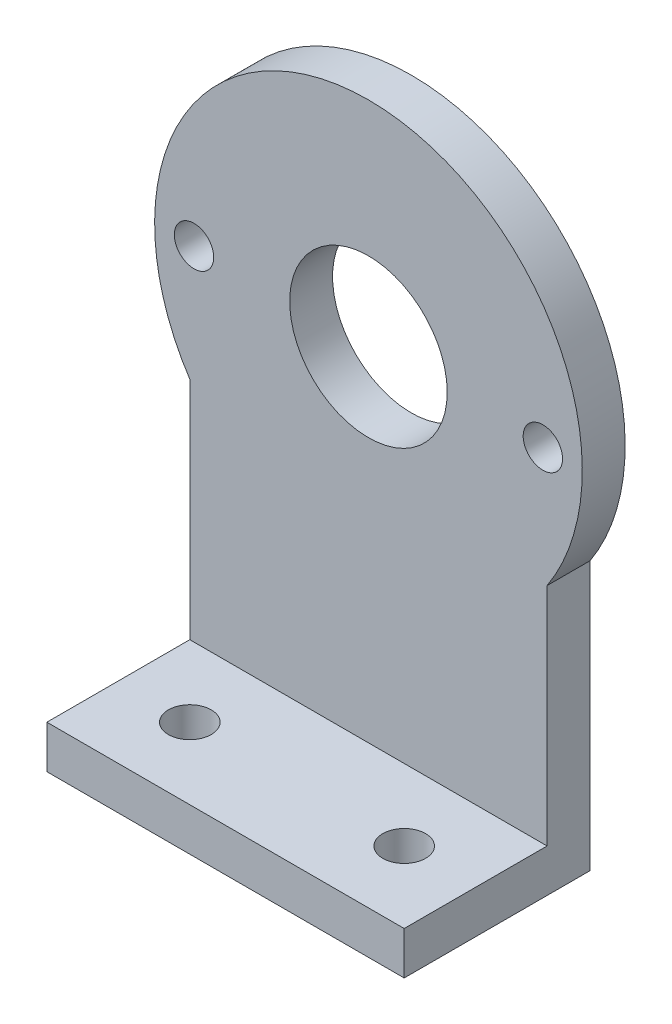
ISO-10303-21;
HEADER;
FILE_DESCRIPTION(('STEP AP214'),'2;1');
FILE_NAME('part.step','',(''),(''),'','','');
FILE_SCHEMA(('AUTOMOTIVE_DESIGN { 1 0 10303 214 1 1 1 1 }'));
ENDSEC;
DATA;
#1=APPLICATION_CONTEXT('core data for automotive mechanical design processes');
#2=APPLICATION_PROTOCOL_DEFINITION('international standard','automotive_design',2000,#1);
#3=PRODUCT_CONTEXT('',#1,'mechanical');
#4=PRODUCT('Part','Part','',(#3));
#5=PRODUCT_RELATED_PRODUCT_CATEGORY('part','',(#4));
#6=PRODUCT_DEFINITION_FORMATION('','',#4);
#7=PRODUCT_DEFINITION_CONTEXT('part definition',#1,'design');
#8=PRODUCT_DEFINITION('design','',#6,#7);
#9=PRODUCT_DEFINITION_SHAPE('','',#8);
#10=(LENGTH_UNIT() NAMED_UNIT(*) SI_UNIT(.MILLI.,.METRE.));
#11=(NAMED_UNIT(*) PLANE_ANGLE_UNIT() SI_UNIT($,.RADIAN.));
#12=(NAMED_UNIT(*) SI_UNIT($,.STERADIAN.) SOLID_ANGLE_UNIT());
#13=UNCERTAINTY_MEASURE_WITH_UNIT(LENGTH_MEASURE(1.E-05),#10,'distance_accuracy_value','');
#14=(GEOMETRIC_REPRESENTATION_CONTEXT(3) GLOBAL_UNCERTAINTY_ASSIGNED_CONTEXT((#13)) GLOBAL_UNIT_ASSIGNED_CONTEXT((#10,
#11,#12)) REPRESENTATION_CONTEXT('',''));
#15=CARTESIAN_POINT('',(0.,0.,0.));
#16=DIRECTION('',(0.,0.,1.));
#17=DIRECTION('',(1.,0.,0.));
#18=AXIS2_PLACEMENT_3D('',#15,#16,#17);
#19=CARTESIAN_POINT('',(0.,0.,3.81));
#20=DIRECTION('',(0.,0.,-1.));
#21=DIRECTION('',(-1.,0.,0.));
#22=AXIS2_PLACEMENT_3D('',#19,#20,#21);
#23=CYLINDRICAL_SURFACE('',#22,19.);
#24=CARTESIAN_POINT('',(0.,0.,3.81));
#25=DIRECTION('',(0.,0.,1.));
#26=DIRECTION('',(1.,0.,0.));
#27=AXIS2_PLACEMENT_3D('',#24,#25,#26);
#28=CIRCLE('',#27,19.);
#29=CARTESIAN_POINT('',(15.875,-10.4395581803063,3.81));
#30=VERTEX_POINT('',#29);
#31=CARTESIAN_POINT('',(-15.875,-10.4395581803063,3.81));
#32=VERTEX_POINT('',#31);
#33=EDGE_CURVE('E155',#30,#32,#28,.T.);
#34=ORIENTED_EDGE('',*,*,#33,.F.);
#35=DIRECTION('',(0.,0.,-1.));
#36=VECTOR('',#35,1.);
#37=CARTESIAN_POINT('',(15.875,-10.4395581803063,3.81));
#38=LINE('',#37,#36);
#39=CARTESIAN_POINT('',(15.875,-10.4395581803063,0.));
#40=VERTEX_POINT('',#39);
#41=EDGE_CURVE('E12',#30,#40,#38,.T.);
#42=ORIENTED_EDGE('',*,*,#41,.T.);
#43=CARTESIAN_POINT('',(0.,0.,0.));
#44=DIRECTION('',(0.,0.,1.));
#45=DIRECTION('',(1.,0.,0.));
#46=AXIS2_PLACEMENT_3D('',#43,#44,#45);
#47=CIRCLE('',#46,19.);
#48=CARTESIAN_POINT('',(-15.875,-10.4395581803063,0.));
#49=VERTEX_POINT('',#48);
#50=EDGE_CURVE('E158',#40,#49,#47,.T.);
#51=ORIENTED_EDGE('',*,*,#50,.T.);
#52=DIRECTION('',(0.,0.,-1.));
#53=VECTOR('',#52,1.);
#54=CARTESIAN_POINT('',(-15.875,-10.4395581803063,3.81));
#55=LINE('',#54,#53);
#56=EDGE_CURVE('E67',#32,#49,#55,.T.);
#57=ORIENTED_EDGE('',*,*,#56,.F.);
#58=EDGE_LOOP('',(#34,#42,#51,#57));
#59=FACE_BOUND('',#58,.T.);
#60=ADVANCED_FACE('F58',(#59),#23,.T.);
#61=CARTESIAN_POINT('',(0.,0.,0.));
#62=DIRECTION('',(0.,0.,1.));
#63=DIRECTION('',(1.,0.,0.));
#64=AXIS2_PLACEMENT_3D('',#61,#62,#63);
#65=PLANE('',#64);
#66=CARTESIAN_POINT('',(15.5,0.,0.));
#67=DIRECTION('',(0.,0.,1.));
#68=DIRECTION('',(1.,0.,0.));
#69=AXIS2_PLACEMENT_3D('',#66,#67,#68);
#70=CIRCLE('',#69,1.75);
#71=CARTESIAN_POINT('',(17.25,0.,0.));
#72=VERTEX_POINT('',#71);
#73=EDGE_CURVE('E235',#72,#72,#70,.T.);
#74=ORIENTED_EDGE('',*,*,#73,.T.);
#75=EDGE_LOOP('',(#74));
#76=FACE_BOUND('',#75,.T.);
#77=CARTESIAN_POINT('',(-15.5,0.,0.));
#78=DIRECTION('',(0.,0.,1.));
#79=DIRECTION('',(-1.,0.,0.));
#80=AXIS2_PLACEMENT_3D('',#77,#78,#79);
#81=CIRCLE('',#80,1.75);
#82=CARTESIAN_POINT('',(-13.75,0.,0.));
#83=VERTEX_POINT('',#82);
#84=EDGE_CURVE('E242',#83,#83,#81,.T.);
#85=ORIENTED_EDGE('',*,*,#84,.T.);
#86=EDGE_LOOP('',(#85));
#87=FACE_BOUND('',#86,.T.);
#88=CARTESIAN_POINT('',(0.,0.,0.));
#89=DIRECTION('',(0.,0.,1.));
#90=DIRECTION('',(1.,0.,0.));
#91=AXIS2_PLACEMENT_3D('',#88,#89,#90);
#92=CIRCLE('',#91,7.);
#93=CARTESIAN_POINT('',(7.,0.,0.));
#94=VERTEX_POINT('',#93);
#95=EDGE_CURVE('E149',#94,#94,#92,.T.);
#96=ORIENTED_EDGE('',*,*,#95,.T.);
#97=EDGE_LOOP('',(#96));
#98=FACE_BOUND('',#97,.T.);
#99=ORIENTED_EDGE('',*,*,#50,.F.);
#100=DIRECTION('',(0.,-1.,0.));
#101=VECTOR('',#100,1.);
#102=CARTESIAN_POINT('',(15.875,-10.4395581803063,0.));
#103=LINE('',#102,#101);
#104=CARTESIAN_POINT('',(15.875,-34.29,0.));
#105=VERTEX_POINT('',#104);
#106=EDGE_CURVE('E166',#40,#105,#103,.T.);
#107=ORIENTED_EDGE('',*,*,#106,.T.);
#108=DIRECTION('',(1.,0.,0.));
#109=VECTOR('',#108,1.);
#110=CARTESIAN_POINT('',(-15.875,-34.29,0.));
#111=LINE('',#110,#109);
#112=CARTESIAN_POINT('',(-15.875,-34.29,0.));
#113=VERTEX_POINT('',#112);
#114=EDGE_CURVE('E152',#113,#105,#111,.T.);
#115=ORIENTED_EDGE('',*,*,#114,.F.);
#116=DIRECTION('',(0.,-1.,0.));
#117=VECTOR('',#116,1.);
#118=CARTESIAN_POINT('',(-15.875,-10.4395581803063,0.));
#119=LINE('',#118,#117);
#120=EDGE_CURVE('E97',#49,#113,#119,.T.);
#121=ORIENTED_EDGE('',*,*,#120,.F.);
#122=EDGE_LOOP('',(#99,#107,#115,#121));
#123=FACE_BOUND('',#122,.T.);
#124=ADVANCED_FACE('F171',(#76,#87,#98,#123),#65,.F.);
#125=CARTESIAN_POINT('',(0.,0.,3.81));
#126=DIRECTION('',(0.,0.,1.));
#127=DIRECTION('',(1.,0.,0.));
#128=AXIS2_PLACEMENT_3D('',#125,#126,#127);
#129=PLANE('',#128);
#130=CARTESIAN_POINT('',(15.5,0.,3.81));
#131=DIRECTION('',(0.,0.,1.));
#132=DIRECTION('',(1.,0.,0.));
#133=AXIS2_PLACEMENT_3D('',#130,#131,#132);
#134=CIRCLE('',#133,1.75);
#135=CARTESIAN_POINT('',(17.25,0.,3.81));
#136=VERTEX_POINT('',#135);
#137=EDGE_CURVE('E237',#136,#136,#134,.T.);
#138=ORIENTED_EDGE('',*,*,#137,.F.);
#139=EDGE_LOOP('',(#138));
#140=FACE_BOUND('',#139,.T.);
#141=CARTESIAN_POINT('',(-15.5,0.,3.81));
#142=DIRECTION('',(0.,0.,1.));
#143=DIRECTION('',(-1.,0.,0.));
#144=AXIS2_PLACEMENT_3D('',#141,#142,#143);
#145=CIRCLE('',#144,1.75);
#146=CARTESIAN_POINT('',(-13.75,0.,3.81));
#147=VERTEX_POINT('',#146);
#148=EDGE_CURVE('E238',#147,#147,#145,.T.);
#149=ORIENTED_EDGE('',*,*,#148,.F.);
#150=EDGE_LOOP('',(#149));
#151=FACE_BOUND('',#150,.T.);
#152=DIRECTION('',(-1.,0.,0.));
#153=VECTOR('',#152,1.);
#154=CARTESIAN_POINT('',(-15.875,-30.48,3.81));
#155=LINE('',#154,#153);
#156=CARTESIAN_POINT('',(15.875,-30.48,3.81));
#157=VERTEX_POINT('',#156);
#158=CARTESIAN_POINT('',(-15.875,-30.48,3.81));
#159=VERTEX_POINT('',#158);
#160=EDGE_CURVE('E75',#157,#159,#155,.T.);
#161=ORIENTED_EDGE('',*,*,#160,.F.);
#162=DIRECTION('',(0.,-1.,0.));
#163=VECTOR('',#162,1.);
#164=CARTESIAN_POINT('',(15.875,-10.4395581803063,3.81));
#165=LINE('',#164,#163);
#166=EDGE_CURVE('E162',#30,#157,#165,.T.);
#167=ORIENTED_EDGE('',*,*,#166,.F.);
#168=ORIENTED_EDGE('',*,*,#33,.T.);
#169=DIRECTION('',(0.,-1.,0.));
#170=VECTOR('',#169,1.);
#171=CARTESIAN_POINT('',(-15.875,-10.4395581803063,3.81));
#172=LINE('',#171,#170);
#173=EDGE_CURVE('E123',#32,#159,#172,.T.);
#174=ORIENTED_EDGE('',*,*,#173,.T.);
#175=EDGE_LOOP('',(#161,#167,#168,#174));
#176=FACE_BOUND('',#175,.T.);
#177=CARTESIAN_POINT('',(0.,0.,3.81));
#178=DIRECTION('',(0.,0.,1.));
#179=DIRECTION('',(1.,0.,0.));
#180=AXIS2_PLACEMENT_3D('',#177,#178,#179);
#181=CIRCLE('',#180,7.);
#182=CARTESIAN_POINT('',(7.,0.,3.81));
#183=VERTEX_POINT('',#182);
#184=EDGE_CURVE('E148',#183,#183,#181,.T.);
#185=ORIENTED_EDGE('',*,*,#184,.F.);
#186=EDGE_LOOP('',(#185));
#187=FACE_BOUND('',#186,.T.);
#188=ADVANCED_FACE('F177',(#140,#151,#176,#187),#129,.T.);
#189=CARTESIAN_POINT('',(-15.875,-10.4395581803063,3.81));
#190=DIRECTION('',(1.,0.,0.));
#191=DIRECTION('',(0.,1.,0.));
#192=AXIS2_PLACEMENT_3D('',#189,#190,#191);
#193=PLANE('',#192);
#194=ORIENTED_EDGE('',*,*,#120,.T.);
#195=DIRECTION('',(0.,0.,-1.));
#196=VECTOR('',#195,1.);
#197=CARTESIAN_POINT('',(-15.875,-34.29,3.81));
#198=LINE('',#197,#196);
#199=CARTESIAN_POINT('',(-15.875,-34.29,16.51));
#200=VERTEX_POINT('',#199);
#201=EDGE_CURVE('E114',#200,#113,#198,.T.);
#202=ORIENTED_EDGE('',*,*,#201,.F.);
#203=DIRECTION('',(0.,-1.,0.));
#204=VECTOR('',#203,1.);
#205=CARTESIAN_POINT('',(-15.875,-34.29,16.51));
#206=LINE('',#205,#204);
#207=CARTESIAN_POINT('',(-15.875,-30.48,16.51));
#208=VERTEX_POINT('',#207);
#209=EDGE_CURVE('E119',#208,#200,#206,.T.);
#210=ORIENTED_EDGE('',*,*,#209,.F.);
#211=DIRECTION('',(0.,0.,-1.));
#212=VECTOR('',#211,1.);
#213=CARTESIAN_POINT('',(-15.875,-30.48,16.51));
#214=LINE('',#213,#212);
#215=EDGE_CURVE('E142',#208,#159,#214,.T.);
#216=ORIENTED_EDGE('',*,*,#215,.T.);
#217=ORIENTED_EDGE('',*,*,#173,.F.);
#218=ORIENTED_EDGE('',*,*,#56,.T.);
#219=EDGE_LOOP('',(#194,#202,#210,#216,#217,#218));
#220=FACE_BOUND('',#219,.T.);
#221=ADVANCED_FACE('F116',(#220),#193,.F.);
#222=CARTESIAN_POINT('',(-15.875,-34.29,3.81));
#223=DIRECTION('',(0.,1.,0.));
#224=DIRECTION('',(0.,0.,1.));
#225=AXIS2_PLACEMENT_3D('',#222,#223,#224);
#226=PLANE('',#225);
#227=CARTESIAN_POINT('',(-9.525,-34.29,10.16));
#228=DIRECTION('',(0.,1.,0.));
#229=DIRECTION('',(0.,0.,1.));
#230=AXIS2_PLACEMENT_3D('',#227,#228,#229);
#231=CIRCLE('',#230,1.905);
#232=CARTESIAN_POINT('',(-9.525,-34.29,12.065));
#233=VERTEX_POINT('',#232);
#234=EDGE_CURVE('E135',#233,#233,#231,.T.);
#235=ORIENTED_EDGE('',*,*,#234,.T.);
#236=EDGE_LOOP('',(#235));
#237=FACE_BOUND('',#236,.T.);
#238=CARTESIAN_POINT('',(9.525,-34.29,10.16));
#239=DIRECTION('',(0.,1.,0.));
#240=DIRECTION('',(0.,0.,-1.));
#241=AXIS2_PLACEMENT_3D('',#238,#239,#240);
#242=CIRCLE('',#241,1.905);
#243=CARTESIAN_POINT('',(9.525,-34.29,8.255));
#244=VERTEX_POINT('',#243);
#245=EDGE_CURVE('E138',#244,#244,#242,.T.);
#246=ORIENTED_EDGE('',*,*,#245,.T.);
#247=EDGE_LOOP('',(#246));
#248=FACE_BOUND('',#247,.T.);
#249=ORIENTED_EDGE('',*,*,#114,.T.);
#250=DIRECTION('',(0.,0.,-1.));
#251=VECTOR('',#250,1.);
#252=CARTESIAN_POINT('',(15.875,-34.29,3.81));
#253=LINE('',#252,#251);
#254=CARTESIAN_POINT('',(15.875,-34.29,16.51));
#255=VERTEX_POINT('',#254);
#256=EDGE_CURVE('E62',#255,#105,#253,.T.);
#257=ORIENTED_EDGE('',*,*,#256,.F.);
#258=DIRECTION('',(1.,0.,0.));
#259=VECTOR('',#258,1.);
#260=CARTESIAN_POINT('',(-15.875,-34.29,16.51));
#261=LINE('',#260,#259);
#262=EDGE_CURVE('E125',#200,#255,#261,.T.);
#263=ORIENTED_EDGE('',*,*,#262,.F.);
#264=ORIENTED_EDGE('',*,*,#201,.T.);
#265=EDGE_LOOP('',(#249,#257,#263,#264));
#266=FACE_BOUND('',#265,.T.);
#267=ADVANCED_FACE('F60',(#237,#248,#266),#226,.F.);
#268=CARTESIAN_POINT('',(15.875,-10.4395581803063,3.81));
#269=DIRECTION('',(1.,0.,0.));
#270=DIRECTION('',(0.,1.,0.));
#271=AXIS2_PLACEMENT_3D('',#268,#269,#270);
#272=PLANE('',#271);
#273=ORIENTED_EDGE('',*,*,#106,.F.);
#274=ORIENTED_EDGE('',*,*,#41,.F.);
#275=ORIENTED_EDGE('',*,*,#166,.T.);
#276=DIRECTION('',(0.,0.,-1.));
#277=VECTOR('',#276,1.);
#278=CARTESIAN_POINT('',(15.875,-30.48,16.51));
#279=LINE('',#278,#277);
#280=CARTESIAN_POINT('',(15.875,-30.48,16.51));
#281=VERTEX_POINT('',#280);
#282=EDGE_CURVE('E145',#281,#157,#279,.T.);
#283=ORIENTED_EDGE('',*,*,#282,.F.);
#284=DIRECTION('',(0.,1.,0.));
#285=VECTOR('',#284,1.);
#286=CARTESIAN_POINT('',(15.875,-34.29,16.51));
#287=LINE('',#286,#285);
#288=EDGE_CURVE('E128',#255,#281,#287,.T.);
#289=ORIENTED_EDGE('',*,*,#288,.F.);
#290=ORIENTED_EDGE('',*,*,#256,.T.);
#291=EDGE_LOOP('',(#273,#274,#275,#283,#289,#290));
#292=FACE_BOUND('',#291,.T.);
#293=ADVANCED_FACE('F172',(#292),#272,.T.);
#294=CARTESIAN_POINT('',(0.,0.,0.));
#295=DIRECTION('',(0.,0.,1.));
#296=DIRECTION('',(1.,0.,0.));
#297=AXIS2_PLACEMENT_3D('',#294,#295,#296);
#298=CYLINDRICAL_SURFACE('',#297,7.);
#299=CARTESIAN_POINT('',(7.,0.,0.));
#300=CARTESIAN_POINT('',(7.,0.,0.0396874999999999));
#301=CARTESIAN_POINT('',(7.,0.,0.079375));
#302=CARTESIAN_POINT('',(7.,0.,0.15875));
#303=CARTESIAN_POINT('',(7.,0.,0.1984375));
#304=CARTESIAN_POINT('',(7.,0.,0.2778125));
#305=CARTESIAN_POINT('',(7.,0.,0.3175));
#306=CARTESIAN_POINT('',(7.,0.,0.396875));
#307=CARTESIAN_POINT('',(7.,0.,0.4365625));
#308=CARTESIAN_POINT('',(7.,0.,0.5159375));
#309=CARTESIAN_POINT('',(7.,0.,0.555625));
#310=CARTESIAN_POINT('',(7.,0.,0.635));
#311=CARTESIAN_POINT('',(7.,0.,0.6746875));
#312=CARTESIAN_POINT('',(7.,0.,0.7540625));
#313=CARTESIAN_POINT('',(7.,0.,0.79375));
#314=CARTESIAN_POINT('',(7.,0.,0.873125));
#315=CARTESIAN_POINT('',(7.,0.,0.9128125));
#316=CARTESIAN_POINT('',(7.,0.,0.9921875));
#317=CARTESIAN_POINT('',(7.,0.,1.031875));
#318=CARTESIAN_POINT('',(7.,0.,1.11125));
#319=CARTESIAN_POINT('',(7.,0.,1.1509375));
#320=CARTESIAN_POINT('',(7.,0.,1.2303125));
#321=CARTESIAN_POINT('',(7.,0.,1.27));
#322=CARTESIAN_POINT('',(7.,0.,1.349375));
#323=CARTESIAN_POINT('',(7.,0.,1.3890625));
#324=CARTESIAN_POINT('',(7.,0.,1.4684375));
#325=CARTESIAN_POINT('',(7.,0.,1.508125));
#326=CARTESIAN_POINT('',(7.,0.,1.5875));
#327=CARTESIAN_POINT('',(7.,0.,1.6271875));
#328=CARTESIAN_POINT('',(7.,0.,1.7065625));
#329=CARTESIAN_POINT('',(7.,0.,1.74625));
#330=CARTESIAN_POINT('',(7.,0.,1.825625));
#331=CARTESIAN_POINT('',(7.,0.,1.8653125));
#332=CARTESIAN_POINT('',(7.,0.,1.9446875));
#333=CARTESIAN_POINT('',(7.,0.,1.984375));
#334=CARTESIAN_POINT('',(7.,0.,2.06375));
#335=CARTESIAN_POINT('',(7.,0.,2.1034375));
#336=CARTESIAN_POINT('',(7.,0.,2.1828125));
#337=CARTESIAN_POINT('',(7.,0.,2.2225));
#338=CARTESIAN_POINT('',(7.,0.,2.301875));
#339=CARTESIAN_POINT('',(7.,0.,2.3415625));
#340=CARTESIAN_POINT('',(7.,0.,2.4209375));
#341=CARTESIAN_POINT('',(7.,0.,2.460625));
#342=CARTESIAN_POINT('',(7.,0.,2.54));
#343=CARTESIAN_POINT('',(7.,0.,2.5796875));
#344=CARTESIAN_POINT('',(7.,0.,2.6590625));
#345=CARTESIAN_POINT('',(7.,0.,2.69875));
#346=CARTESIAN_POINT('',(7.,0.,2.778125));
#347=CARTESIAN_POINT('',(7.,0.,2.8178125));
#348=CARTESIAN_POINT('',(7.,0.,2.8971875));
#349=CARTESIAN_POINT('',(7.,0.,2.936875));
#350=CARTESIAN_POINT('',(7.,0.,3.01625));
#351=CARTESIAN_POINT('',(7.,0.,3.0559375));
#352=CARTESIAN_POINT('',(7.,0.,3.1353125));
#353=CARTESIAN_POINT('',(7.,0.,3.175));
#354=CARTESIAN_POINT('',(7.,0.,3.254375));
#355=CARTESIAN_POINT('',(7.,0.,3.2940625));
#356=CARTESIAN_POINT('',(7.,0.,3.3734375));
#357=CARTESIAN_POINT('',(7.,0.,3.413125));
#358=CARTESIAN_POINT('',(7.,0.,3.4925));
#359=CARTESIAN_POINT('',(7.,0.,3.5321875));
#360=CARTESIAN_POINT('',(7.,0.,3.6115625));
#361=CARTESIAN_POINT('',(7.,0.,3.65125));
#362=CARTESIAN_POINT('',(7.,0.,3.730625));
#363=CARTESIAN_POINT('',(7.,0.,3.7703125));
#364=CARTESIAN_POINT('',(7.,0.,3.81));
#365=B_SPLINE_CURVE_WITH_KNOTS('',3,(#299,#300,#301,#302,#303,#304,#305,#306,#307,#308,#309,
#310,#311,#312,#313,#314,#315,#316,#317,#318,#319,#320,#321,#322,#323,#324,#325,#326,#327,#328,
#329,#330,#331,#332,#333,#334,#335,#336,#337,#338,#339,#340,#341,#342,#343,#344,#345,#346,#347,
#348,#349,#350,#351,#352,#353,#354,#355,#356,#357,#358,#359,#360,#361,#362,#363,#364),
.UNSPECIFIED.,.F.,.F.,(4,2,2,2,2,2,2,2,2,2,2,2,2,2,2,2,2,2,2,2,2,2,2,2,2,2,2,2,2,2,2,2,4),(0.,
0.1190625,0.238125,0.3571875,0.47625,0.5953125,0.714375,0.8334375,0.9525,1.0715625,1.190625,
1.3096875,1.42875,1.5478125,1.666875,1.7859375,1.905,2.0240625,2.143125,2.2621875,2.38125,
2.5003125,2.619375,2.7384375,2.8575,2.9765625,3.095625,3.2146875,3.33375,3.4528125,3.571875,
3.6909375,3.81),.UNSPECIFIED.);
#366=EDGE_CURVE('BSEAM191',#94,#183,#365,.T.);
#367=ORIENTED_EDGE('',*,*,#95,.F.);
#368=ORIENTED_EDGE('',*,*,#184,.T.);
#369=ORIENTED_EDGE('',*,*,#366,.T.);
#370=ORIENTED_EDGE('',*,*,#366,.F.);
#371=EDGE_LOOP('',(#367,#369,#368,#370));
#372=FACE_BOUND('',#371,.T.);
#373=ADVANCED_FACE('F191',(#372),#298,.F.);
#374=CARTESIAN_POINT('',(-15.875,-30.48,16.51));
#375=DIRECTION('',(0.,-1.,0.));
#376=DIRECTION('',(0.,0.,-1.));
#377=AXIS2_PLACEMENT_3D('',#374,#375,#376);
#378=PLANE('',#377);
#379=CARTESIAN_POINT('',(-9.525,-30.48,10.16));
#380=DIRECTION('',(0.,1.,0.));
#381=DIRECTION('',(0.,0.,1.));
#382=AXIS2_PLACEMENT_3D('',#379,#380,#381);
#383=CIRCLE('',#382,1.905);
#384=CARTESIAN_POINT('',(-9.525,-30.48,12.065));
#385=VERTEX_POINT('',#384);
#386=EDGE_CURVE('E248',#385,#385,#383,.T.);
#387=ORIENTED_EDGE('',*,*,#386,.F.);
#388=EDGE_LOOP('',(#387));
#389=FACE_BOUND('',#388,.T.);
#390=CARTESIAN_POINT('',(9.525,-30.48,10.16));
#391=DIRECTION('',(0.,1.,0.));
#392=DIRECTION('',(0.,0.,-1.));
#393=AXIS2_PLACEMENT_3D('',#390,#391,#392);
#394=CIRCLE('',#393,1.905);
#395=CARTESIAN_POINT('',(9.525,-30.48,8.255));
#396=VERTEX_POINT('',#395);
#397=EDGE_CURVE('E250',#396,#396,#394,.T.);
#398=ORIENTED_EDGE('',*,*,#397,.F.);
#399=EDGE_LOOP('',(#398));
#400=FACE_BOUND('',#399,.T.);
#401=ORIENTED_EDGE('',*,*,#160,.T.);
#402=ORIENTED_EDGE('',*,*,#215,.F.);
#403=DIRECTION('',(-1.,0.,0.));
#404=VECTOR('',#403,1.);
#405=CARTESIAN_POINT('',(-15.875,-30.48,16.51));
#406=LINE('',#405,#404);
#407=EDGE_CURVE('E132',#281,#208,#406,.T.);
#408=ORIENTED_EDGE('',*,*,#407,.F.);
#409=ORIENTED_EDGE('',*,*,#282,.T.);
#410=EDGE_LOOP('',(#401,#402,#408,#409));
#411=FACE_BOUND('',#410,.T.);
#412=ADVANCED_FACE('F175',(#389,#400,#411),#378,.F.);
#413=CARTESIAN_POINT('',(0.,0.,16.51));
#414=DIRECTION('',(0.,0.,-1.));
#415=DIRECTION('',(-1.,0.,0.));
#416=AXIS2_PLACEMENT_3D('',#413,#414,#415);
#417=PLANE('',#416);
#418=ORIENTED_EDGE('',*,*,#209,.T.);
#419=ORIENTED_EDGE('',*,*,#262,.T.);
#420=ORIENTED_EDGE('',*,*,#288,.T.);
#421=ORIENTED_EDGE('',*,*,#407,.T.);
#422=EDGE_LOOP('',(#418,#419,#420,#421));
#423=FACE_BOUND('',#422,.T.);
#424=ADVANCED_FACE('F130',(#423),#417,.F.);
#425=CARTESIAN_POINT('',(9.525,-34.29,10.16));
#426=DIRECTION('',(0.,1.,0.));
#427=DIRECTION('',(0.,0.,1.));
#428=AXIS2_PLACEMENT_3D('',#425,#426,#427);
#429=CYLINDRICAL_SURFACE('',#428,1.905);
#430=ORIENTED_EDGE('',*,*,#245,.F.);
#431=EDGE_LOOP('',(#430));
#432=FACE_BOUND('',#431,.T.);
#433=ORIENTED_EDGE('',*,*,#397,.T.);
#434=EDGE_LOOP('',(#433));
#435=FACE_BOUND('',#434,.T.);
#436=ADVANCED_FACE('F216',(#432,#435),#429,.F.);
#437=CARTESIAN_POINT('',(-9.525,-34.29,10.16));
#438=DIRECTION('',(0.,1.,0.));
#439=DIRECTION('',(0.,0.,1.));
#440=AXIS2_PLACEMENT_3D('',#437,#438,#439);
#441=CYLINDRICAL_SURFACE('',#440,1.905);
#442=ORIENTED_EDGE('',*,*,#234,.F.);
#443=EDGE_LOOP('',(#442));
#444=FACE_BOUND('',#443,.T.);
#445=ORIENTED_EDGE('',*,*,#386,.T.);
#446=EDGE_LOOP('',(#445));
#447=FACE_BOUND('',#446,.T.);
#448=ADVANCED_FACE('F219',(#444,#447),#441,.F.);
#449=CARTESIAN_POINT('',(-15.5,0.,0.));
#450=DIRECTION('',(0.,0.,1.));
#451=DIRECTION('',(1.,0.,0.));
#452=AXIS2_PLACEMENT_3D('',#449,#450,#451);
#453=CYLINDRICAL_SURFACE('',#452,1.75);
#454=CARTESIAN_POINT('',(-13.75,0.,0.));
#455=CARTESIAN_POINT('',(-13.75,0.,0.0396874999999999));
#456=CARTESIAN_POINT('',(-13.75,0.,0.079375));
#457=CARTESIAN_POINT('',(-13.75,0.,0.15875));
#458=CARTESIAN_POINT('',(-13.75,0.,0.1984375));
#459=CARTESIAN_POINT('',(-13.75,0.,0.2778125));
#460=CARTESIAN_POINT('',(-13.75,0.,0.3175));
#461=CARTESIAN_POINT('',(-13.75,0.,0.396875));
#462=CARTESIAN_POINT('',(-13.75,0.,0.4365625));
#463=CARTESIAN_POINT('',(-13.75,0.,0.5159375));
#464=CARTESIAN_POINT('',(-13.75,0.,0.555625));
#465=CARTESIAN_POINT('',(-13.75,0.,0.635));
#466=CARTESIAN_POINT('',(-13.75,0.,0.6746875));
#467=CARTESIAN_POINT('',(-13.75,0.,0.7540625));
#468=CARTESIAN_POINT('',(-13.75,0.,0.79375));
#469=CARTESIAN_POINT('',(-13.75,0.,0.873125));
#470=CARTESIAN_POINT('',(-13.75,0.,0.9128125));
#471=CARTESIAN_POINT('',(-13.75,0.,0.9921875));
#472=CARTESIAN_POINT('',(-13.75,0.,1.031875));
#473=CARTESIAN_POINT('',(-13.75,0.,1.11125));
#474=CARTESIAN_POINT('',(-13.75,0.,1.1509375));
#475=CARTESIAN_POINT('',(-13.75,0.,1.2303125));
#476=CARTESIAN_POINT('',(-13.75,0.,1.27));
#477=CARTESIAN_POINT('',(-13.75,0.,1.349375));
#478=CARTESIAN_POINT('',(-13.75,0.,1.3890625));
#479=CARTESIAN_POINT('',(-13.75,0.,1.4684375));
#480=CARTESIAN_POINT('',(-13.75,0.,1.508125));
#481=CARTESIAN_POINT('',(-13.75,0.,1.5875));
#482=CARTESIAN_POINT('',(-13.75,0.,1.6271875));
#483=CARTESIAN_POINT('',(-13.75,0.,1.7065625));
#484=CARTESIAN_POINT('',(-13.75,0.,1.74625));
#485=CARTESIAN_POINT('',(-13.75,0.,1.825625));
#486=CARTESIAN_POINT('',(-13.75,0.,1.8653125));
#487=CARTESIAN_POINT('',(-13.75,0.,1.9446875));
#488=CARTESIAN_POINT('',(-13.75,0.,1.984375));
#489=CARTESIAN_POINT('',(-13.75,0.,2.06375));
#490=CARTESIAN_POINT('',(-13.75,0.,2.1034375));
#491=CARTESIAN_POINT('',(-13.75,0.,2.1828125));
#492=CARTESIAN_POINT('',(-13.75,0.,2.2225));
#493=CARTESIAN_POINT('',(-13.75,0.,2.301875));
#494=CARTESIAN_POINT('',(-13.75,0.,2.3415625));
#495=CARTESIAN_POINT('',(-13.75,0.,2.4209375));
#496=CARTESIAN_POINT('',(-13.75,0.,2.460625));
#497=CARTESIAN_POINT('',(-13.75,0.,2.54));
#498=CARTESIAN_POINT('',(-13.75,0.,2.5796875));
#499=CARTESIAN_POINT('',(-13.75,0.,2.6590625));
#500=CARTESIAN_POINT('',(-13.75,0.,2.69875));
#501=CARTESIAN_POINT('',(-13.75,0.,2.778125));
#502=CARTESIAN_POINT('',(-13.75,0.,2.8178125));
#503=CARTESIAN_POINT('',(-13.75,0.,2.8971875));
#504=CARTESIAN_POINT('',(-13.75,0.,2.936875));
#505=CARTESIAN_POINT('',(-13.75,0.,3.01625));
#506=CARTESIAN_POINT('',(-13.75,0.,3.0559375));
#507=CARTESIAN_POINT('',(-13.75,0.,3.1353125));
#508=CARTESIAN_POINT('',(-13.75,0.,3.175));
#509=CARTESIAN_POINT('',(-13.75,0.,3.254375));
#510=CARTESIAN_POINT('',(-13.75,0.,3.2940625));
#511=CARTESIAN_POINT('',(-13.75,0.,3.3734375));
#512=CARTESIAN_POINT('',(-13.75,0.,3.413125));
#513=CARTESIAN_POINT('',(-13.75,0.,3.4925));
#514=CARTESIAN_POINT('',(-13.75,0.,3.5321875));
#515=CARTESIAN_POINT('',(-13.75,0.,3.6115625));
#516=CARTESIAN_POINT('',(-13.75,0.,3.65125));
#517=CARTESIAN_POINT('',(-13.75,0.,3.730625));
#518=CARTESIAN_POINT('',(-13.75,0.,3.7703125));
#519=CARTESIAN_POINT('',(-13.75,0.,3.81));
#520=B_SPLINE_CURVE_WITH_KNOTS('',3,(#454,#455,#456,#457,#458,#459,#460,#461,#462,#463,#464,
#465,#466,#467,#468,#469,#470,#471,#472,#473,#474,#475,#476,#477,#478,#479,#480,#481,#482,#483,
#484,#485,#486,#487,#488,#489,#490,#491,#492,#493,#494,#495,#496,#497,#498,#499,#500,#501,#502,
#503,#504,#505,#506,#507,#508,#509,#510,#511,#512,#513,#514,#515,#516,#517,#518,#519),
.UNSPECIFIED.,.F.,.F.,(4,2,2,2,2,2,2,2,2,2,2,2,2,2,2,2,2,2,2,2,2,2,2,2,2,2,2,2,2,2,2,2,4),(0.,
0.1190625,0.238125,0.3571875,0.47625,0.5953125,0.714375,0.8334375,0.9525,1.0715625,1.190625,
1.3096875,1.42875,1.5478125,1.666875,1.7859375,1.905,2.0240625,2.143125,2.2621875,2.38125,
2.5003125,2.619375,2.7384375,2.8575,2.9765625,3.095625,3.2146875,3.33375,3.4528125,3.571875,
3.6909375,3.81),.UNSPECIFIED.);
#521=EDGE_CURVE('BSEAM223',#83,#147,#520,.T.);
#522=ORIENTED_EDGE('',*,*,#84,.F.);
#523=ORIENTED_EDGE('',*,*,#148,.T.);
#524=ORIENTED_EDGE('',*,*,#521,.T.);
#525=ORIENTED_EDGE('',*,*,#521,.F.);
#526=EDGE_LOOP('',(#522,#524,#523,#525));
#527=FACE_BOUND('',#526,.T.);
#528=ADVANCED_FACE('F223',(#527),#453,.F.);
#529=CARTESIAN_POINT('',(15.5,0.,0.));
#530=DIRECTION('',(0.,0.,1.));
#531=DIRECTION('',(1.,0.,0.));
#532=AXIS2_PLACEMENT_3D('',#529,#530,#531);
#533=CYLINDRICAL_SURFACE('',#532,1.75);
#534=CARTESIAN_POINT('',(17.25,0.,0.));
#535=CARTESIAN_POINT('',(17.25,0.,0.0396874999999999));
#536=CARTESIAN_POINT('',(17.25,0.,0.079375));
#537=CARTESIAN_POINT('',(17.25,0.,0.15875));
#538=CARTESIAN_POINT('',(17.25,0.,0.1984375));
#539=CARTESIAN_POINT('',(17.25,0.,0.2778125));
#540=CARTESIAN_POINT('',(17.25,0.,0.3175));
#541=CARTESIAN_POINT('',(17.25,0.,0.396875));
#542=CARTESIAN_POINT('',(17.25,0.,0.4365625));
#543=CARTESIAN_POINT('',(17.25,0.,0.5159375));
#544=CARTESIAN_POINT('',(17.25,0.,0.555625));
#545=CARTESIAN_POINT('',(17.25,0.,0.635));
#546=CARTESIAN_POINT('',(17.25,0.,0.6746875));
#547=CARTESIAN_POINT('',(17.25,0.,0.7540625));
#548=CARTESIAN_POINT('',(17.25,0.,0.79375));
#549=CARTESIAN_POINT('',(17.25,0.,0.873125));
#550=CARTESIAN_POINT('',(17.25,0.,0.9128125));
#551=CARTESIAN_POINT('',(17.25,0.,0.9921875));
#552=CARTESIAN_POINT('',(17.25,0.,1.031875));
#553=CARTESIAN_POINT('',(17.25,0.,1.11125));
#554=CARTESIAN_POINT('',(17.25,0.,1.1509375));
#555=CARTESIAN_POINT('',(17.25,0.,1.2303125));
#556=CARTESIAN_POINT('',(17.25,0.,1.27));
#557=CARTESIAN_POINT('',(17.25,0.,1.349375));
#558=CARTESIAN_POINT('',(17.25,0.,1.3890625));
#559=CARTESIAN_POINT('',(17.25,0.,1.4684375));
#560=CARTESIAN_POINT('',(17.25,0.,1.508125));
#561=CARTESIAN_POINT('',(17.25,0.,1.5875));
#562=CARTESIAN_POINT('',(17.25,0.,1.6271875));
#563=CARTESIAN_POINT('',(17.25,0.,1.7065625));
#564=CARTESIAN_POINT('',(17.25,0.,1.74625));
#565=CARTESIAN_POINT('',(17.25,0.,1.825625));
#566=CARTESIAN_POINT('',(17.25,0.,1.8653125));
#567=CARTESIAN_POINT('',(17.25,0.,1.9446875));
#568=CARTESIAN_POINT('',(17.25,0.,1.984375));
#569=CARTESIAN_POINT('',(17.25,0.,2.06375));
#570=CARTESIAN_POINT('',(17.25,0.,2.1034375));
#571=CARTESIAN_POINT('',(17.25,0.,2.1828125));
#572=CARTESIAN_POINT('',(17.25,0.,2.2225));
#573=CARTESIAN_POINT('',(17.25,0.,2.301875));
#574=CARTESIAN_POINT('',(17.25,0.,2.3415625));
#575=CARTESIAN_POINT('',(17.25,0.,2.4209375));
#576=CARTESIAN_POINT('',(17.25,0.,2.460625));
#577=CARTESIAN_POINT('',(17.25,0.,2.54));
#578=CARTESIAN_POINT('',(17.25,0.,2.5796875));
#579=CARTESIAN_POINT('',(17.25,0.,2.6590625));
#580=CARTESIAN_POINT('',(17.25,0.,2.69875));
#581=CARTESIAN_POINT('',(17.25,0.,2.778125));
#582=CARTESIAN_POINT('',(17.25,0.,2.8178125));
#583=CARTESIAN_POINT('',(17.25,0.,2.8971875));
#584=CARTESIAN_POINT('',(17.25,0.,2.936875));
#585=CARTESIAN_POINT('',(17.25,0.,3.01625));
#586=CARTESIAN_POINT('',(17.25,0.,3.0559375));
#587=CARTESIAN_POINT('',(17.25,0.,3.1353125));
#588=CARTESIAN_POINT('',(17.25,0.,3.175));
#589=CARTESIAN_POINT('',(17.25,0.,3.254375));
#590=CARTESIAN_POINT('',(17.25,0.,3.2940625));
#591=CARTESIAN_POINT('',(17.25,0.,3.3734375));
#592=CARTESIAN_POINT('',(17.25,0.,3.413125));
#593=CARTESIAN_POINT('',(17.25,0.,3.4925));
#594=CARTESIAN_POINT('',(17.25,0.,3.5321875));
#595=CARTESIAN_POINT('',(17.25,0.,3.6115625));
#596=CARTESIAN_POINT('',(17.25,0.,3.65125));
#597=CARTESIAN_POINT('',(17.25,0.,3.730625));
#598=CARTESIAN_POINT('',(17.25,0.,3.7703125));
#599=CARTESIAN_POINT('',(17.25,0.,3.81));
#600=B_SPLINE_CURVE_WITH_KNOTS('',3,(#534,#535,#536,#537,#538,#539,#540,#541,#542,#543,#544,
#545,#546,#547,#548,#549,#550,#551,#552,#553,#554,#555,#556,#557,#558,#559,#560,#561,#562,#563,
#564,#565,#566,#567,#568,#569,#570,#571,#572,#573,#574,#575,#576,#577,#578,#579,#580,#581,#582,
#583,#584,#585,#586,#587,#588,#589,#590,#591,#592,#593,#594,#595,#596,#597,#598,#599),
.UNSPECIFIED.,.F.,.F.,(4,2,2,2,2,2,2,2,2,2,2,2,2,2,2,2,2,2,2,2,2,2,2,2,2,2,2,2,2,2,2,2,4),(0.,
0.1190625,0.238125,0.3571875,0.47625,0.5953125,0.714375,0.8334375,0.9525,1.0715625,1.190625,
1.3096875,1.42875,1.5478125,1.666875,1.7859375,1.905,2.0240625,2.143125,2.2621875,2.38125,
2.5003125,2.619375,2.7384375,2.8575,2.9765625,3.095625,3.2146875,3.33375,3.4528125,3.571875,
3.6909375,3.81),.UNSPECIFIED.);
#601=EDGE_CURVE('BSEAM226',#72,#136,#600,.T.);
#602=ORIENTED_EDGE('',*,*,#73,.F.);
#603=ORIENTED_EDGE('',*,*,#137,.T.);
#604=ORIENTED_EDGE('',*,*,#601,.T.);
#605=ORIENTED_EDGE('',*,*,#601,.F.);
#606=EDGE_LOOP('',(#602,#604,#603,#605));
#607=FACE_BOUND('',#606,.T.);
#608=ADVANCED_FACE('F226',(#607),#533,.F.);
#609=CLOSED_SHELL('',(#60,#124,#188,#221,#267,#293,#373,#412,#424,#436,#448,#528,#608));
#610=MANIFOLD_SOLID_BREP('B2',#609);
#611=ADVANCED_BREP_SHAPE_REPRESENTATION('',(#18,#610),#14);
#612=SHAPE_DEFINITION_REPRESENTATION(#9,#611);
ENDSEC;
END-ISO-10303-21;
